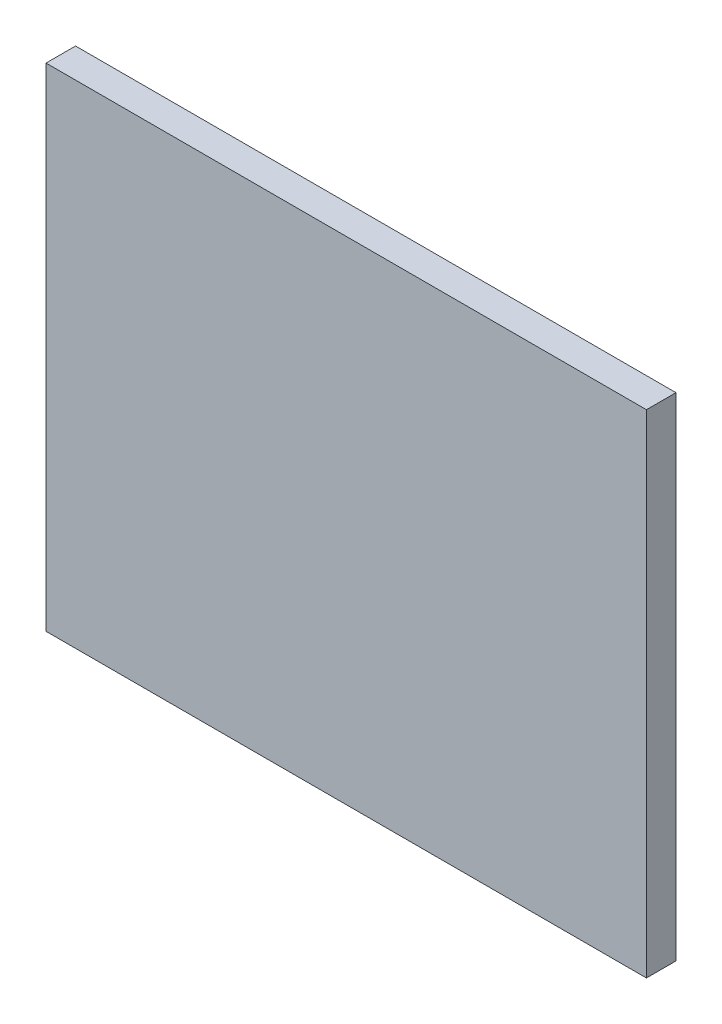
ISO-10303-21;
HEADER;
FILE_DESCRIPTION(('STEP AP214'),'2;1');
FILE_NAME('part.step','',(''),(''),'','','');
FILE_SCHEMA(('AUTOMOTIVE_DESIGN { 1 0 10303 214 1 1 1 1 }'));
ENDSEC;
DATA;
#1=APPLICATION_CONTEXT('core data for automotive mechanical design processes');
#2=APPLICATION_PROTOCOL_DEFINITION('international standard','automotive_design',2000,#1);
#3=PRODUCT_CONTEXT('',#1,'mechanical');
#4=PRODUCT('Part','Part','',(#3));
#5=PRODUCT_RELATED_PRODUCT_CATEGORY('part','',(#4));
#6=PRODUCT_DEFINITION_FORMATION('','',#4);
#7=PRODUCT_DEFINITION_CONTEXT('part definition',#1,'design');
#8=PRODUCT_DEFINITION('design','',#6,#7);
#9=PRODUCT_DEFINITION_SHAPE('','',#8);
#10=(LENGTH_UNIT() NAMED_UNIT(*) SI_UNIT(.MILLI.,.METRE.));
#11=(NAMED_UNIT(*) PLANE_ANGLE_UNIT() SI_UNIT($,.RADIAN.));
#12=(NAMED_UNIT(*) SI_UNIT($,.STERADIAN.) SOLID_ANGLE_UNIT());
#13=UNCERTAINTY_MEASURE_WITH_UNIT(LENGTH_MEASURE(1.E-05),#10,'distance_accuracy_value','');
#14=(GEOMETRIC_REPRESENTATION_CONTEXT(3) GLOBAL_UNCERTAINTY_ASSIGNED_CONTEXT((#13)) GLOBAL_UNIT_ASSIGNED_CONTEXT((#10,
#11,#12)) REPRESENTATION_CONTEXT('',''));
#15=CARTESIAN_POINT('',(0.,0.,0.));
#16=DIRECTION('',(0.,0.,1.));
#17=DIRECTION('',(1.,0.,0.));
#18=AXIS2_PLACEMENT_3D('',#15,#16,#17);
#19=CARTESIAN_POINT('',(30.5,25.,3.));
#20=DIRECTION('',(-1.,0.,0.));
#21=DIRECTION('',(0.,0.,1.));
#22=AXIS2_PLACEMENT_3D('',#19,#20,#21);
#23=PLANE('',#22);
#24=DIRECTION('',(0.,1.,0.));
#25=VECTOR('',#24,1.);
#26=CARTESIAN_POINT('',(30.5,25.,0.));
#27=LINE('',#26,#25);
#28=CARTESIAN_POINT('',(30.5,-25.,0.));
#29=VERTEX_POINT('',#28);
#30=CARTESIAN_POINT('',(30.5,25.,0.));
#31=VERTEX_POINT('',#30);
#32=EDGE_CURVE('E98',#29,#31,#27,.T.);
#33=ORIENTED_EDGE('',*,*,#32,.T.);
#34=DIRECTION('',(0.,0.,-1.));
#35=VECTOR('',#34,1.);
#36=CARTESIAN_POINT('',(30.5,25.,3.));
#37=LINE('',#36,#35);
#38=CARTESIAN_POINT('',(30.5,25.,3.));
#39=VERTEX_POINT('',#38);
#40=EDGE_CURVE('E11',#39,#31,#37,.T.);
#41=ORIENTED_EDGE('',*,*,#40,.F.);
#42=DIRECTION('',(0.,1.,0.));
#43=VECTOR('',#42,1.);
#44=CARTESIAN_POINT('',(30.5,25.,3.));
#45=LINE('',#44,#43);
#46=CARTESIAN_POINT('',(30.5,-25.,3.));
#47=VERTEX_POINT('',#46);
#48=EDGE_CURVE('E86',#47,#39,#45,.T.);
#49=ORIENTED_EDGE('',*,*,#48,.F.);
#50=DIRECTION('',(0.,0.,-1.));
#51=VECTOR('',#50,1.);
#52=CARTESIAN_POINT('',(30.5,-25.,3.));
#53=LINE('',#52,#51);
#54=EDGE_CURVE('E94',#47,#29,#53,.T.);
#55=ORIENTED_EDGE('',*,*,#54,.T.);
#56=EDGE_LOOP('',(#33,#41,#49,#55));
#57=FACE_BOUND('',#56,.T.);
#58=ADVANCED_FACE('F35',(#57),#23,.F.);
#59=CARTESIAN_POINT('',(-30.5,25.,3.));
#60=DIRECTION('',(0.,-1.,0.));
#61=DIRECTION('',(0.,0.,-1.));
#62=AXIS2_PLACEMENT_3D('',#59,#60,#61);
#63=PLANE('',#62);
#64=DIRECTION('',(-1.,0.,0.));
#65=VECTOR('',#64,1.);
#66=CARTESIAN_POINT('',(-30.5,25.,0.));
#67=LINE('',#66,#65);
#68=CARTESIAN_POINT('',(-30.5,25.,0.));
#69=VERTEX_POINT('',#68);
#70=EDGE_CURVE('E90',#31,#69,#67,.T.);
#71=ORIENTED_EDGE('',*,*,#70,.T.);
#72=DIRECTION('',(0.,0.,-1.));
#73=VECTOR('',#72,1.);
#74=CARTESIAN_POINT('',(-30.5,25.,3.));
#75=LINE('',#74,#73);
#76=CARTESIAN_POINT('',(-30.5,25.,3.));
#77=VERTEX_POINT('',#76);
#78=EDGE_CURVE('E43',#77,#69,#75,.T.);
#79=ORIENTED_EDGE('',*,*,#78,.F.);
#80=DIRECTION('',(-1.,0.,0.));
#81=VECTOR('',#80,1.);
#82=CARTESIAN_POINT('',(-30.5,25.,3.));
#83=LINE('',#82,#81);
#84=EDGE_CURVE('E81',#39,#77,#83,.T.);
#85=ORIENTED_EDGE('',*,*,#84,.F.);
#86=ORIENTED_EDGE('',*,*,#40,.T.);
#87=EDGE_LOOP('',(#71,#79,#85,#86));
#88=FACE_BOUND('',#87,.T.);
#89=ADVANCED_FACE('F89',(#88),#63,.F.);
#90=CARTESIAN_POINT('',(-30.5,25.,3.));
#91=DIRECTION('',(1.,0.,0.));
#92=DIRECTION('',(0.,0.,-1.));
#93=AXIS2_PLACEMENT_3D('',#90,#91,#92);
#94=PLANE('',#93);
#95=DIRECTION('',(0.,-1.,0.));
#96=VECTOR('',#95,1.);
#97=CARTESIAN_POINT('',(-30.5,25.,0.));
#98=LINE('',#97,#96);
#99=CARTESIAN_POINT('',(-30.5,-25.,0.));
#100=VERTEX_POINT('',#99);
#101=EDGE_CURVE('E68',#69,#100,#98,.T.);
#102=ORIENTED_EDGE('',*,*,#101,.T.);
#103=DIRECTION('',(0.,0.,-1.));
#104=VECTOR('',#103,1.);
#105=CARTESIAN_POINT('',(-30.5,-25.,3.));
#106=LINE('',#105,#104);
#107=CARTESIAN_POINT('',(-30.5,-25.,3.));
#108=VERTEX_POINT('',#107);
#109=EDGE_CURVE('E91',#108,#100,#106,.T.);
#110=ORIENTED_EDGE('',*,*,#109,.F.);
#111=DIRECTION('',(0.,-1.,0.));
#112=VECTOR('',#111,1.);
#113=CARTESIAN_POINT('',(-30.5,25.,3.));
#114=LINE('',#113,#112);
#115=EDGE_CURVE('E84',#77,#108,#114,.T.);
#116=ORIENTED_EDGE('',*,*,#115,.F.);
#117=ORIENTED_EDGE('',*,*,#78,.T.);
#118=EDGE_LOOP('',(#102,#110,#116,#117));
#119=FACE_BOUND('',#118,.T.);
#120=ADVANCED_FACE('F92',(#119),#94,.F.);
#121=CARTESIAN_POINT('',(-30.5,-25.,3.));
#122=DIRECTION('',(0.,1.,0.));
#123=DIRECTION('',(0.,0.,1.));
#124=AXIS2_PLACEMENT_3D('',#121,#122,#123);
#125=PLANE('',#124);
#126=DIRECTION('',(1.,0.,0.));
#127=VECTOR('',#126,1.);
#128=CARTESIAN_POINT('',(-30.5,-25.,0.));
#129=LINE('',#128,#127);
#130=EDGE_CURVE('E74',#100,#29,#129,.T.);
#131=ORIENTED_EDGE('',*,*,#130,.T.);
#132=ORIENTED_EDGE('',*,*,#54,.F.);
#133=DIRECTION('',(1.,0.,0.));
#134=VECTOR('',#133,1.);
#135=CARTESIAN_POINT('',(-30.5,-25.,3.));
#136=LINE('',#135,#134);
#137=EDGE_CURVE('E51',#108,#47,#136,.T.);
#138=ORIENTED_EDGE('',*,*,#137,.F.);
#139=ORIENTED_EDGE('',*,*,#109,.T.);
#140=EDGE_LOOP('',(#131,#132,#138,#139));
#141=FACE_BOUND('',#140,.T.);
#142=ADVANCED_FACE('F105',(#141),#125,.F.);
#143=CARTESIAN_POINT('',(0.,0.,3.));
#144=DIRECTION('',(0.,0.,1.));
#145=DIRECTION('',(1.,0.,0.));
#146=AXIS2_PLACEMENT_3D('',#143,#144,#145);
#147=PLANE('',#146);
#148=ORIENTED_EDGE('',*,*,#48,.T.);
#149=ORIENTED_EDGE('',*,*,#84,.T.);
#150=ORIENTED_EDGE('',*,*,#115,.T.);
#151=ORIENTED_EDGE('',*,*,#137,.T.);
#152=EDGE_LOOP('',(#148,#149,#150,#151));
#153=FACE_BOUND('',#152,.T.);
#154=ADVANCED_FACE('F82',(#153),#147,.T.);
#155=CARTESIAN_POINT('',(0.,0.,0.));
#156=DIRECTION('',(0.,0.,1.));
#157=DIRECTION('',(1.,0.,0.));
#158=AXIS2_PLACEMENT_3D('',#155,#156,#157);
#159=PLANE('',#158);
#160=ORIENTED_EDGE('',*,*,#32,.F.);
#161=ORIENTED_EDGE('',*,*,#130,.F.);
#162=ORIENTED_EDGE('',*,*,#101,.F.);
#163=ORIENTED_EDGE('',*,*,#70,.F.);
#164=EDGE_LOOP('',(#160,#161,#162,#163));
#165=FACE_BOUND('',#164,.T.);
#166=ADVANCED_FACE('F108',(#165),#159,.F.);
#167=CLOSED_SHELL('',(#58,#89,#120,#142,#154,#166));
#168=MANIFOLD_SOLID_BREP('B2',#167);
#169=ADVANCED_BREP_SHAPE_REPRESENTATION('',(#18,#168),#14);
#170=SHAPE_DEFINITION_REPRESENTATION(#9,#169);
ENDSEC;
END-ISO-10303-21;
